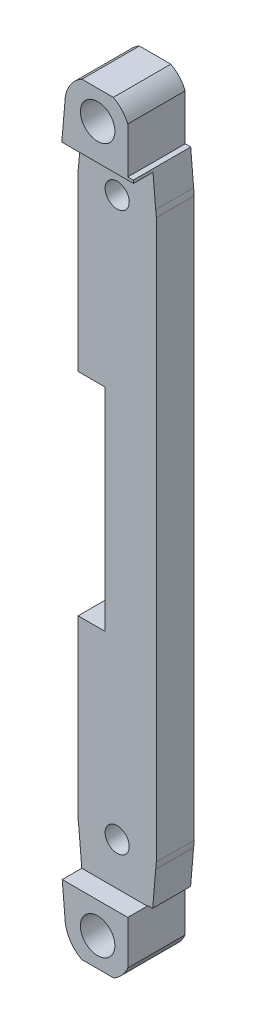
ISO-10303-21;
HEADER;
FILE_DESCRIPTION(('STEP AP214'),'2;1');
FILE_NAME('part.step','',(''),(''),'','','');
FILE_SCHEMA(('AUTOMOTIVE_DESIGN { 1 0 10303 214 1 1 1 1 }'));
ENDSEC;
DATA;
#1=APPLICATION_CONTEXT('core data for automotive mechanical design processes');
#2=APPLICATION_PROTOCOL_DEFINITION('international standard','automotive_design',2000,#1);
#3=PRODUCT_CONTEXT('',#1,'mechanical');
#4=PRODUCT('Part','Part','',(#3));
#5=PRODUCT_RELATED_PRODUCT_CATEGORY('part','',(#4));
#6=PRODUCT_DEFINITION_FORMATION('','',#4);
#7=PRODUCT_DEFINITION_CONTEXT('part definition',#1,'design');
#8=PRODUCT_DEFINITION('design','',#6,#7);
#9=PRODUCT_DEFINITION_SHAPE('','',#8);
#10=(LENGTH_UNIT() NAMED_UNIT(*) SI_UNIT(.MILLI.,.METRE.));
#11=(NAMED_UNIT(*) PLANE_ANGLE_UNIT() SI_UNIT($,.RADIAN.));
#12=(NAMED_UNIT(*) SI_UNIT($,.STERADIAN.) SOLID_ANGLE_UNIT());
#13=UNCERTAINTY_MEASURE_WITH_UNIT(LENGTH_MEASURE(1.E-05),#10,'distance_accuracy_value','');
#14=(GEOMETRIC_REPRESENTATION_CONTEXT(3) GLOBAL_UNCERTAINTY_ASSIGNED_CONTEXT((#13)) GLOBAL_UNIT_ASSIGNED_CONTEXT((#10,
#11,#12)) REPRESENTATION_CONTEXT('',''));
#15=CARTESIAN_POINT('',(0.,0.,0.));
#16=DIRECTION('',(0.,0.,1.));
#17=DIRECTION('',(1.,0.,0.));
#18=AXIS2_PLACEMENT_3D('',#15,#16,#17);
#19=CARTESIAN_POINT('',(-44.1261324023902,30.2904471176475,5.));
#20=DIRECTION('',(0.,0.,-1.));
#21=DIRECTION('',(-1.,0.,0.));
#22=AXIS2_PLACEMENT_3D('',#19,#20,#21);
#23=CYLINDRICAL_SURFACE('',#22,2.85);
#24=CARTESIAN_POINT('',(-44.1261324023902,30.2904471176475,5.));
#25=DIRECTION('',(0.,0.,1.));
#26=DIRECTION('',(1.,0.,0.));
#27=AXIS2_PLACEMENT_3D('',#24,#25,#26);
#28=CIRCLE('',#27,2.85);
#29=CARTESIAN_POINT('',(-45.4931797029006,32.7911833448749,5.));
#30=VERTEX_POINT('',#29);
#31=CARTESIAN_POINT('',(-46.9761324023902,30.2904471176475,5.));
#32=VERTEX_POINT('',#31);
#33=EDGE_CURVE('E391',#30,#32,#28,.T.);
#34=ORIENTED_EDGE('',*,*,#33,.F.);
#35=DIRECTION('',(0.,0.,-1.));
#36=VECTOR('',#35,1.);
#37=CARTESIAN_POINT('',(-45.4931797029006,32.7911833448749,5.));
#38=LINE('',#37,#36);
#39=CARTESIAN_POINT('',(-45.4931797029006,32.7911833448749,0.));
#40=VERTEX_POINT('',#39);
#41=EDGE_CURVE('E259',#30,#40,#38,.T.);
#42=ORIENTED_EDGE('',*,*,#41,.T.);
#43=CARTESIAN_POINT('',(-44.1261324023902,30.2904471176475,0.));
#44=DIRECTION('',(0.,0.,1.));
#45=DIRECTION('',(1.,0.,0.));
#46=AXIS2_PLACEMENT_3D('',#43,#44,#45);
#47=CIRCLE('',#46,2.85);
#48=CARTESIAN_POINT('',(-46.9761324023902,30.2904471176475,0.));
#49=VERTEX_POINT('',#48);
#50=EDGE_CURVE('E410',#40,#49,#47,.T.);
#51=ORIENTED_EDGE('',*,*,#50,.T.);
#52=DIRECTION('',(0.,0.,-1.));
#53=VECTOR('',#52,1.);
#54=CARTESIAN_POINT('',(-46.9761324023902,30.2904471176475,5.));
#55=LINE('',#54,#53);
#56=EDGE_CURVE('E435',#32,#49,#55,.T.);
#57=ORIENTED_EDGE('',*,*,#56,.F.);
#58=EDGE_LOOP('',(#34,#42,#51,#57));
#59=FACE_BOUND('',#58,.T.);
#60=ADVANCED_FACE('F34',(#59),#23,.T.);
#61=CARTESIAN_POINT('',(-44.1261324023902,-31.0495528823525,5.));
#62=DIRECTION('',(0.,0.,-1.));
#63=DIRECTION('',(-1.,0.,0.));
#64=AXIS2_PLACEMENT_3D('',#61,#62,#63);
#65=CYLINDRICAL_SURFACE('',#64,2.85);
#66=CARTESIAN_POINT('',(-44.1261324023902,-31.0495528823525,0.));
#67=DIRECTION('',(0.,0.,1.));
#68=DIRECTION('',(1.,0.,0.));
#69=AXIS2_PLACEMENT_3D('',#66,#67,#68);
#70=CIRCLE('',#69,2.85);
#71=CARTESIAN_POINT('',(-42.7268335781129,-33.532386505529,0.));
#72=VERTEX_POINT('',#71);
#73=CARTESIAN_POINT('',(-41.5056305366104,-32.17003044636,0.));
#74=VERTEX_POINT('',#73);
#75=EDGE_CURVE('E422',#72,#74,#70,.T.);
#76=ORIENTED_EDGE('',*,*,#75,.T.);
#77=DIRECTION('',(0.,0.,-1.));
#78=VECTOR('',#77,1.);
#79=CARTESIAN_POINT('',(-41.5056305366104,-32.17003044636,5.));
#80=LINE('',#79,#78);
#81=CARTESIAN_POINT('',(-41.5056305366104,-32.17003044636,5.));
#82=VERTEX_POINT('',#81);
#83=EDGE_CURVE('E249',#74,#82,#80,.F.);
#84=ORIENTED_EDGE('',*,*,#83,.T.);
#85=CARTESIAN_POINT('',(-44.1261324023902,-31.0495528823525,5.));
#86=DIRECTION('',(0.,0.,1.));
#87=DIRECTION('',(1.,0.,0.));
#88=AXIS2_PLACEMENT_3D('',#85,#86,#87);
#89=CIRCLE('',#88,2.85);
#90=CARTESIAN_POINT('',(-42.7268335781129,-33.532386505529,5.));
#91=VERTEX_POINT('',#90);
#92=EDGE_CURVE('E401',#91,#82,#89,.T.);
#93=ORIENTED_EDGE('',*,*,#92,.F.);
#94=DIRECTION('',(0.,0.,-1.));
#95=VECTOR('',#94,1.);
#96=CARTESIAN_POINT('',(-42.7268335781129,-33.532386505529,5.));
#97=LINE('',#96,#95);
#98=EDGE_CURVE('E265',#91,#72,#97,.T.);
#99=ORIENTED_EDGE('',*,*,#98,.T.);
#100=EDGE_LOOP('',(#76,#84,#93,#99));
#101=FACE_BOUND('',#100,.T.);
#102=ADVANCED_FACE('F563',(#101),#65,.T.);
#103=CARTESIAN_POINT('',(-47.5261324023902,0.,5.));
#104=DIRECTION('',(-1.,0.,0.));
#105=DIRECTION('',(0.,0.,1.));
#106=AXIS2_PLACEMENT_3D('',#103,#104,#105);
#107=PLANE('',#106);
#108=DIRECTION('',(0.,0.,-1.));
#109=VECTOR('',#108,1.);
#110=CARTESIAN_POINT('',(-47.5261324023902,-9.49691108424844,11.7));
#111=LINE('',#110,#109);
#112=CARTESIAN_POINT('',(-47.5261324023902,-9.49691108424844,3.3));
#113=VERTEX_POINT('',#112);
#114=CARTESIAN_POINT('',(-47.5261324023902,-9.49691108424844,0.));
#115=VERTEX_POINT('',#114);
#116=EDGE_CURVE('E283',#113,#115,#111,.T.);
#117=ORIENTED_EDGE('',*,*,#116,.T.);
#118=DIRECTION('',(0.,1.,0.));
#119=VECTOR('',#118,1.);
#120=CARTESIAN_POINT('',(-47.5261324023902,0.,0.));
#121=LINE('',#120,#119);
#122=CARTESIAN_POINT('',(-47.5261324023902,-24.6495528823525,0.));
#123=VERTEX_POINT('',#122);
#124=EDGE_CURVE('E416',#123,#115,#121,.T.);
#125=ORIENTED_EDGE('',*,*,#124,.F.);
#126=DIRECTION('',(0.,0.,-1.));
#127=VECTOR('',#126,1.);
#128=CARTESIAN_POINT('',(-47.5261324023902,-24.6495528823525,5.));
#129=LINE('',#128,#127);
#130=CARTESIAN_POINT('',(-47.5261324023902,-24.6495528823525,3.3));
#131=VERTEX_POINT('',#130);
#132=EDGE_CURVE('E430',#131,#123,#129,.T.);
#133=ORIENTED_EDGE('',*,*,#132,.F.);
#134=DIRECTION('',(0.,1.,0.));
#135=VECTOR('',#134,1.);
#136=CARTESIAN_POINT('',(-47.5261324023902,0.,3.3));
#137=LINE('',#136,#135);
#138=EDGE_CURVE('E313',#131,#113,#137,.T.);
#139=ORIENTED_EDGE('',*,*,#138,.T.);
#140=EDGE_LOOP('',(#117,#125,#133,#139));
#141=FACE_BOUND('',#140,.T.);
#142=ADVANCED_FACE('F477',(#141),#107,.T.);
#143=CARTESIAN_POINT('',(-40.7261324023902,0.,5.));
#144=DIRECTION('',(1.,0.,0.));
#145=DIRECTION('',(0.,0.,-1.));
#146=AXIS2_PLACEMENT_3D('',#143,#144,#145);
#147=PLANE('',#146);
#148=DIRECTION('',(0.,0.,-1.));
#149=VECTOR('',#148,1.);
#150=CARTESIAN_POINT('',(-40.7261324023902,23.8904471176475,5.));
#151=LINE('',#150,#149);
#152=CARTESIAN_POINT('',(-40.7261324023902,23.8904471176475,3.3));
#153=VERTEX_POINT('',#152);
#154=CARTESIAN_POINT('',(-40.7261324023902,23.8904471176475,0.));
#155=VERTEX_POINT('',#154);
#156=EDGE_CURVE('E438',#153,#155,#151,.T.);
#157=ORIENTED_EDGE('',*,*,#156,.F.);
#158=DIRECTION('',(0.,-1.,0.));
#159=VECTOR('',#158,1.);
#160=CARTESIAN_POINT('',(-40.7261324023902,0.,3.3));
#161=LINE('',#160,#159);
#162=CARTESIAN_POINT('',(-40.7261324023902,-24.6495528823525,3.3));
#163=VERTEX_POINT('',#162);
#164=EDGE_CURVE('E328',#153,#163,#161,.T.);
#165=ORIENTED_EDGE('',*,*,#164,.T.);
#166=DIRECTION('',(0.,0.,-1.));
#167=VECTOR('',#166,1.);
#168=CARTESIAN_POINT('',(-40.7261324023902,-24.6495528823525,5.));
#169=LINE('',#168,#167);
#170=CARTESIAN_POINT('',(-40.7261324023902,-24.6495528823525,0.));
#171=VERTEX_POINT('',#170);
#172=EDGE_CURVE('E405',#163,#171,#169,.T.);
#173=ORIENTED_EDGE('',*,*,#172,.T.);
#174=DIRECTION('',(0.,-1.,0.));
#175=VECTOR('',#174,1.);
#176=CARTESIAN_POINT('',(-40.7261324023902,0.,0.));
#177=LINE('',#176,#175);
#178=EDGE_CURVE('E388',#155,#171,#177,.T.);
#179=ORIENTED_EDGE('',*,*,#178,.F.);
#180=EDGE_LOOP('',(#157,#165,#173,#179));
#181=FACE_BOUND('',#180,.T.);
#182=ADVANCED_FACE('F36',(#181),#147,.T.);
#183=DIRECTION('',(0.,0.,-1.));
#184=VECTOR('',#183,1.);
#185=CARTESIAN_POINT('',(-47.5261324023902,8.90561472574801,11.7));
#186=LINE('',#185,#184);
#187=CARTESIAN_POINT('',(-47.5261324023902,8.90561472574801,3.3));
#188=VERTEX_POINT('',#187);
#189=CARTESIAN_POINT('',(-47.5261324023902,8.90561472574801,0.));
#190=VERTEX_POINT('',#189);
#191=EDGE_CURVE('E282',#188,#190,#186,.T.);
#192=ORIENTED_EDGE('',*,*,#191,.F.);
#193=CARTESIAN_POINT('',(-47.5261324023902,23.8904471176475,3.3));
#194=VERTEX_POINT('',#193);
#195=EDGE_CURVE('E312',#188,#194,#137,.T.);
#196=ORIENTED_EDGE('',*,*,#195,.T.);
#197=DIRECTION('',(0.,0.,-1.));
#198=VECTOR('',#197,1.);
#199=CARTESIAN_POINT('',(-47.5261324023902,23.8904471176475,5.));
#200=LINE('',#199,#198);
#201=CARTESIAN_POINT('',(-47.5261324023902,23.8904471176475,0.));
#202=VERTEX_POINT('',#201);
#203=EDGE_CURVE('E432',#194,#202,#200,.T.);
#204=ORIENTED_EDGE('',*,*,#203,.T.);
#205=EDGE_CURVE('E415',#190,#202,#121,.T.);
#206=ORIENTED_EDGE('',*,*,#205,.F.);
#207=EDGE_LOOP('',(#192,#196,#204,#206));
#208=FACE_BOUND('',#207,.T.);
#209=ADVANCED_FACE('F497',(#208),#107,.T.);
#210=CARTESIAN_POINT('',(0.,0.,5.));
#211=DIRECTION('',(0.,0.,1.));
#212=DIRECTION('',(1.,0.,0.));
#213=AXIS2_PLACEMENT_3D('',#210,#211,#212);
#214=PLANE('',#213);
#215=DIRECTION('',(0.,-1.,0.));
#216=VECTOR('',#215,1.);
#217=CARTESIAN_POINT('',(-41.5056305366104,0.,5.));
#218=LINE('',#217,#216);
#219=CARTESIAN_POINT('',(-41.5056305366104,31.4109246816551,5.));
#220=VERTEX_POINT('',#219);
#221=CARTESIAN_POINT('',(-41.5056305366104,27.4189181705271,5.));
#222=VERTEX_POINT('',#221);
#223=EDGE_CURVE('E224',#220,#222,#218,.T.);
#224=ORIENTED_EDGE('',*,*,#223,.F.);
#225=CARTESIAN_POINT('',(-42.7590851018798,32.7911833448749,5.));
#226=VERTEX_POINT('',#225);
#227=EDGE_CURVE('E394',#220,#226,#28,.T.);
#228=ORIENTED_EDGE('',*,*,#227,.T.);
#229=DIRECTION('',(1.,0.,0.));
#230=VECTOR('',#229,1.);
#231=CARTESIAN_POINT('',(0.,32.7911833448749,5.));
#232=LINE('',#231,#230);
#233=EDGE_CURVE('E257',#30,#226,#232,.T.);
#234=ORIENTED_EDGE('',*,*,#233,.F.);
#235=ORIENTED_EDGE('',*,*,#33,.T.);
#236=DIRECTION('',(0.0856219118234825,0.996327701218676,0.));
#237=VECTOR('',#236,1.);
#238=CARTESIAN_POINT('',(-49.2157469144144,4.22947825045761,5.));
#239=LINE('',#238,#237);
#240=CARTESIAN_POINT('',(-47.243450602524,27.1798353342732,5.));
#241=VERTEX_POINT('',#240);
#242=EDGE_CURVE('E395',#241,#32,#239,.T.);
#243=ORIENTED_EDGE('',*,*,#242,.F.);
#244=DIRECTION('',(-1.,0.,0.));
#245=VECTOR('',#244,1.);
#246=CARTESIAN_POINT('',(-48.434796852721,27.1798353342732,5.));
#247=LINE('',#246,#245);
#248=CARTESIAN_POINT('',(-41.0088142022565,27.1798353342732,5.));
#249=VERTEX_POINT('',#248);
#250=EDGE_CURVE('E296',#249,#241,#247,.T.);
#251=ORIENTED_EDGE('',*,*,#250,.F.);
#252=DIRECTION('',(0.0856219118234803,-0.996327701218677,0.));
#253=VECTOR('',#252,1.);
#254=CARTESIAN_POINT('',(-38.3895306718639,-3.29910029211332,5.));
#255=LINE('',#254,#253);
#256=CARTESIAN_POINT('',(-41.0293603834971,27.4189181705271,5.));
#257=VERTEX_POINT('',#256);
#258=EDGE_CURVE('E389',#257,#249,#255,.T.);
#259=ORIENTED_EDGE('',*,*,#258,.F.);
#260=DIRECTION('',(1.,0.,0.));
#261=VECTOR('',#260,1.);
#262=CARTESIAN_POINT('',(0.,27.4189181705271,5.));
#263=LINE('',#262,#261);
#264=EDGE_CURVE('E269',#222,#257,#263,.T.);
#265=ORIENTED_EDGE('',*,*,#264,.F.);
#266=EDGE_LOOP('',(#224,#228,#234,#235,#243,#251,#259,#265));
#267=FACE_BOUND('',#266,.T.);
#268=CARTESIAN_POINT('',(-44.1261324023902,30.2904471176475,5.));
#269=DIRECTION('',(0.,0.,-1.));
#270=DIRECTION('',(-1.,0.,0.));
#271=AXIS2_PLACEMENT_3D('',#268,#269,#270);
#272=CIRCLE('',#271,1.5);
#273=CARTESIAN_POINT('',(-45.6261324023902,30.2904471176475,5.));
#274=VERTEX_POINT('',#273);
#275=EDGE_CURVE('E385',#274,#274,#272,.T.);
#276=ORIENTED_EDGE('',*,*,#275,.T.);
#277=EDGE_LOOP('',(#276));
#278=FACE_BOUND('',#277,.T.);
#279=ADVANCED_FACE('F519',(#267,#278),#214,.T.);
#280=CARTESIAN_POINT('',(-44.1261324023902,23.8904471176475,5.));
#281=DIRECTION('',(0.,0.,-1.));
#282=DIRECTION('',(-1.,0.,0.));
#283=AXIS2_PLACEMENT_3D('',#280,#281,#282);
#284=CYLINDRICAL_SURFACE('',#283,3.40000000000001);
#285=ORIENTED_EDGE('',*,*,#203,.F.);
#286=CARTESIAN_POINT('',(-44.1261324023902,23.8904471176475,3.3));
#287=DIRECTION('',(0.,0.,1.));
#288=DIRECTION('',(1.,0.,0.));
#289=AXIS2_PLACEMENT_3D('',#286,#287,#288);
#290=CIRCLE('',#289,3.40000000000001);
#291=CARTESIAN_POINT('',(-47.4762808422569,24.4705379991986,3.3));
#292=VERTEX_POINT('',#291);
#293=EDGE_CURVE('E316',#194,#292,#290,.F.);
#294=ORIENTED_EDGE('',*,*,#293,.T.);
#295=DIRECTION('',(0.,0.,-1.));
#296=VECTOR('',#295,1.);
#297=CARTESIAN_POINT('',(-47.4762808422569,24.4705379991986,5.));
#298=LINE('',#297,#296);
#299=CARTESIAN_POINT('',(-47.4762808422569,24.4705379991986,0.));
#300=VERTEX_POINT('',#299);
#301=EDGE_CURVE('E377',#292,#300,#298,.T.);
#302=ORIENTED_EDGE('',*,*,#301,.T.);
#303=CARTESIAN_POINT('',(-44.1261324023902,23.8904471176475,0.));
#304=DIRECTION('',(0.,0.,-1.));
#305=DIRECTION('',(-1.,0.,0.));
#306=AXIS2_PLACEMENT_3D('',#303,#304,#305);
#307=CIRCLE('',#306,3.40000000000001);
#308=EDGE_CURVE('E374',#202,#300,#307,.T.);
#309=ORIENTED_EDGE('',*,*,#308,.F.);
#310=EDGE_LOOP('',(#285,#294,#302,#309));
#311=FACE_BOUND('',#310,.T.);
#312=ADVANCED_FACE('F502',(#311),#284,.T.);
#313=DIRECTION('',(0.,0.,-1.));
#314=VECTOR('',#313,1.);
#315=CARTESIAN_POINT('',(-40.7759839625235,24.4705379991986,5.));
#316=LINE('',#315,#314);
#317=CARTESIAN_POINT('',(-40.7759839625235,24.4705379991986,0.));
#318=VERTEX_POINT('',#317);
#319=CARTESIAN_POINT('',(-40.7759839625235,24.4705379991986,3.3));
#320=VERTEX_POINT('',#319);
#321=EDGE_CURVE('E379',#318,#320,#316,.F.);
#322=ORIENTED_EDGE('',*,*,#321,.T.);
#323=CARTESIAN_POINT('',(-44.1261324023902,23.8904471176475,3.3));
#324=DIRECTION('',(0.,0.,1.));
#325=DIRECTION('',(1.,0.,0.));
#326=AXIS2_PLACEMENT_3D('',#323,#324,#325);
#327=CIRCLE('',#326,3.40000000000001);
#328=EDGE_CURVE('E331',#320,#153,#327,.F.);
#329=ORIENTED_EDGE('',*,*,#328,.T.);
#330=ORIENTED_EDGE('',*,*,#156,.T.);
#331=EDGE_CURVE('E373',#318,#155,#307,.T.);
#332=ORIENTED_EDGE('',*,*,#331,.F.);
#333=EDGE_LOOP('',(#322,#329,#330,#332));
#334=FACE_BOUND('',#333,.T.);
#335=ADVANCED_FACE('F532',(#334),#284,.T.);
#336=CARTESIAN_POINT('',(-44.1261324023902,-24.6495528823525,5.));
#337=DIRECTION('',(0.,0.,-1.));
#338=DIRECTION('',(-1.,0.,0.));
#339=AXIS2_PLACEMENT_3D('',#336,#337,#338);
#340=CYLINDRICAL_SURFACE('',#339,3.40000000000001);
#341=ORIENTED_EDGE('',*,*,#172,.F.);
#342=CARTESIAN_POINT('',(-44.1261324023902,-24.6495528823525,3.3));
#343=DIRECTION('',(0.,0.,1.));
#344=DIRECTION('',(1.,0.,0.));
#345=AXIS2_PLACEMENT_3D('',#342,#343,#344);
#346=CIRCLE('',#345,3.40000000000001);
#347=CARTESIAN_POINT('',(-40.7759839625235,-25.2296437639036,3.3));
#348=VERTEX_POINT('',#347);
#349=EDGE_CURVE('E322',#163,#348,#346,.F.);
#350=ORIENTED_EDGE('',*,*,#349,.T.);
#351=DIRECTION('',(0.,0.,-1.));
#352=VECTOR('',#351,1.);
#353=CARTESIAN_POINT('',(-40.7759839625235,-25.2296437639036,5.));
#354=LINE('',#353,#352);
#355=CARTESIAN_POINT('',(-40.7759839625235,-25.2296437639036,0.));
#356=VERTEX_POINT('',#355);
#357=EDGE_CURVE('E368',#348,#356,#354,.T.);
#358=ORIENTED_EDGE('',*,*,#357,.T.);
#359=CARTESIAN_POINT('',(-44.1261324023902,-24.6495528823525,0.));
#360=DIRECTION('',(0.,0.,-1.));
#361=DIRECTION('',(-1.,0.,0.));
#362=AXIS2_PLACEMENT_3D('',#359,#360,#361);
#363=CIRCLE('',#362,3.40000000000001);
#364=EDGE_CURVE('E367',#171,#356,#363,.T.);
#365=ORIENTED_EDGE('',*,*,#364,.F.);
#366=EDGE_LOOP('',(#341,#350,#358,#365));
#367=FACE_BOUND('',#366,.T.);
#368=ADVANCED_FACE('F654',(#367),#340,.T.);
#369=DIRECTION('',(0.,0.,-1.));
#370=VECTOR('',#369,1.);
#371=CARTESIAN_POINT('',(-47.4762808422569,-25.2296437639036,5.));
#372=LINE('',#371,#370);
#373=CARTESIAN_POINT('',(-47.4762808422569,-25.2296437639036,0.));
#374=VERTEX_POINT('',#373);
#375=CARTESIAN_POINT('',(-47.4762808422569,-25.2296437639036,3.3));
#376=VERTEX_POINT('',#375);
#377=EDGE_CURVE('E370',#374,#376,#372,.F.);
#378=ORIENTED_EDGE('',*,*,#377,.T.);
#379=CARTESIAN_POINT('',(-44.1261324023902,-24.6495528823525,3.3));
#380=DIRECTION('',(0.,0.,1.));
#381=DIRECTION('',(1.,0.,0.));
#382=AXIS2_PLACEMENT_3D('',#379,#380,#381);
#383=CIRCLE('',#382,3.40000000000001);
#384=EDGE_CURVE('E306',#376,#131,#383,.F.);
#385=ORIENTED_EDGE('',*,*,#384,.T.);
#386=ORIENTED_EDGE('',*,*,#132,.T.);
#387=EDGE_CURVE('E364',#374,#123,#363,.T.);
#388=ORIENTED_EDGE('',*,*,#387,.F.);
#389=EDGE_LOOP('',(#378,#385,#386,#388));
#390=FACE_BOUND('',#389,.T.);
#391=ADVANCED_FACE('F662',(#390),#340,.T.);
#392=CARTESIAN_POINT('',(-44.1261324023902,-24.6495528823525,5.));
#393=DIRECTION('',(0.,0.,-1.));
#394=DIRECTION('',(-1.,0.,0.));
#395=AXIS2_PLACEMENT_3D('',#392,#393,#394);
#396=CYLINDRICAL_SURFACE('',#395,1.05);
#397=CARTESIAN_POINT('',(-44.1261324023902,-24.6495528823525,0.));
#398=DIRECTION('',(0.,0.,-1.));
#399=DIRECTION('',(-1.,0.,0.));
#400=AXIS2_PLACEMENT_3D('',#397,#398,#399);
#401=CIRCLE('',#400,1.05);
#402=CARTESIAN_POINT('',(-45.1761324023902,-24.6495528823525,0.));
#403=VERTEX_POINT('',#402);
#404=EDGE_CURVE('E361',#403,#403,#401,.T.);
#405=ORIENTED_EDGE('',*,*,#404,.T.);
#406=EDGE_LOOP('',(#405));
#407=FACE_BOUND('',#406,.T.);
#408=CARTESIAN_POINT('',(-44.1261324023902,-24.6495528823525,3.3));
#409=DIRECTION('',(0.,0.,1.));
#410=DIRECTION('',(1.,0.,0.));
#411=AXIS2_PLACEMENT_3D('',#408,#409,#410);
#412=CIRCLE('',#411,1.05);
#413=CARTESIAN_POINT('',(-43.0761324023902,-24.6495528823525,3.3));
#414=VERTEX_POINT('',#413);
#415=EDGE_CURVE('E303',#414,#414,#412,.F.);
#416=ORIENTED_EDGE('',*,*,#415,.F.);
#417=EDGE_LOOP('',(#416));
#418=FACE_BOUND('',#417,.T.);
#419=ADVANCED_FACE('F671',(#407,#418),#396,.F.);
#420=CARTESIAN_POINT('',(-44.1261324023902,23.8904471176475,5.));
#421=DIRECTION('',(0.,0.,-1.));
#422=DIRECTION('',(-1.,0.,0.));
#423=AXIS2_PLACEMENT_3D('',#420,#421,#422);
#424=CYLINDRICAL_SURFACE('',#423,1.05);
#425=CARTESIAN_POINT('',(-44.1261324023902,23.8904471176475,0.));
#426=DIRECTION('',(0.,0.,-1.));
#427=DIRECTION('',(-1.,0.,0.));
#428=AXIS2_PLACEMENT_3D('',#425,#426,#427);
#429=CIRCLE('',#428,1.05);
#430=CARTESIAN_POINT('',(-45.1761324023902,23.8904471176475,0.));
#431=VERTEX_POINT('',#430);
#432=EDGE_CURVE('E358',#431,#431,#429,.T.);
#433=ORIENTED_EDGE('',*,*,#432,.T.);
#434=EDGE_LOOP('',(#433));
#435=FACE_BOUND('',#434,.T.);
#436=CARTESIAN_POINT('',(-44.1261324023902,23.8904471176475,3.3));
#437=DIRECTION('',(0.,0.,1.));
#438=DIRECTION('',(1.,0.,0.));
#439=AXIS2_PLACEMENT_3D('',#436,#437,#438);
#440=CIRCLE('',#439,1.05);
#441=CARTESIAN_POINT('',(-43.0761324023902,23.8904471176475,3.3));
#442=VERTEX_POINT('',#441);
#443=EDGE_CURVE('E299',#442,#442,#440,.F.);
#444=ORIENTED_EDGE('',*,*,#443,.F.);
#445=EDGE_LOOP('',(#444));
#446=FACE_BOUND('',#445,.T.);
#447=ADVANCED_FACE('F597',(#435,#446),#424,.F.);
#448=CARTESIAN_POINT('',(-44.1261324023902,-31.0495528823525,5.));
#449=DIRECTION('',(0.,0.,-1.));
#450=DIRECTION('',(-1.,0.,0.));
#451=AXIS2_PLACEMENT_3D('',#448,#449,#450);
#452=CYLINDRICAL_SURFACE('',#451,1.5);
#453=CARTESIAN_POINT('',(-44.1261324023902,-31.0495528823525,5.));
#454=DIRECTION('',(0.,0.,-1.));
#455=DIRECTION('',(-1.,0.,0.));
#456=AXIS2_PLACEMENT_3D('',#453,#454,#455);
#457=CIRCLE('',#456,1.5);
#458=CARTESIAN_POINT('',(-45.6261324023902,-31.0495528823525,5.));
#459=VERTEX_POINT('',#458);
#460=EDGE_CURVE('E382',#459,#459,#457,.T.);
#461=ORIENTED_EDGE('',*,*,#460,.F.);
#462=EDGE_LOOP('',(#461));
#463=FACE_BOUND('',#462,.T.);
#464=CARTESIAN_POINT('',(-44.1261324023902,-31.0495528823525,2.));
#465=DIRECTION('',(0.,0.,-1.));
#466=DIRECTION('',(-1.,0.,0.));
#467=AXIS2_PLACEMENT_3D('',#464,#465,#466);
#468=CIRCLE('',#467,1.5);
#469=CARTESIAN_POINT('',(-45.6261324023902,-31.0495528823525,2.));
#470=VERTEX_POINT('',#469);
#471=EDGE_CURVE('E348',#470,#470,#468,.F.);
#472=ORIENTED_EDGE('',*,*,#471,.F.);
#473=EDGE_LOOP('',(#472));
#474=FACE_BOUND('',#473,.T.);
#475=ADVANCED_FACE('F591',(#463,#474),#452,.F.);
#476=CARTESIAN_POINT('',(-44.1261324023902,30.2904471176475,5.));
#477=DIRECTION('',(0.,0.,-1.));
#478=DIRECTION('',(-1.,0.,0.));
#479=AXIS2_PLACEMENT_3D('',#476,#477,#478);
#480=CYLINDRICAL_SURFACE('',#479,1.5);
#481=ORIENTED_EDGE('',*,*,#275,.F.);
#482=EDGE_LOOP('',(#481));
#483=FACE_BOUND('',#482,.T.);
#484=CARTESIAN_POINT('',(-44.1261324023902,30.2904471176475,2.));
#485=DIRECTION('',(0.,0.,-1.));
#486=DIRECTION('',(-1.,0.,0.));
#487=AXIS2_PLACEMENT_3D('',#484,#485,#486);
#488=CIRCLE('',#487,1.5);
#489=CARTESIAN_POINT('',(-45.6261324023902,30.2904471176475,2.));
#490=VERTEX_POINT('',#489);
#491=EDGE_CURVE('E354',#490,#490,#488,.F.);
#492=ORIENTED_EDGE('',*,*,#491,.F.);
#493=EDGE_LOOP('',(#492));
#494=FACE_BOUND('',#493,.T.);
#495=ADVANCED_FACE('F587',(#483,#494),#480,.F.);
#496=CARTESIAN_POINT('',(-38.3895306718639,-3.29910029211332,5.));
#497=DIRECTION('',(0.996327701218677,0.0856219118234803,0.));
#498=DIRECTION('',(-0.0856219118234803,0.996327701218677,0.));
#499=AXIS2_PLACEMENT_3D('',#496,#497,#498);
#500=PLANE('',#499);
#501=DIRECTION('',(0.,0.,-1.));
#502=VECTOR('',#501,1.);
#503=CARTESIAN_POINT('',(-41.0293603834971,27.4189181705271,5.));
#504=LINE('',#503,#502);
#505=CARTESIAN_POINT('',(-41.0293603834971,27.4189181705271,0.));
#506=VERTEX_POINT('',#505);
#507=EDGE_CURVE('E57',#257,#506,#504,.T.);
#508=ORIENTED_EDGE('',*,*,#507,.F.);
#509=ORIENTED_EDGE('',*,*,#258,.T.);
#510=DIRECTION('',(0.,0.,1.));
#511=VECTOR('',#510,1.);
#512=CARTESIAN_POINT('',(-41.0088142022565,27.1798353342732,5.));
#513=LINE('',#512,#511);
#514=CARTESIAN_POINT('',(-41.0088142022565,27.1798353342732,3.3));
#515=VERTEX_POINT('',#514);
#516=EDGE_CURVE('E341',#515,#249,#513,.T.);
#517=ORIENTED_EDGE('',*,*,#516,.F.);
#518=DIRECTION('',(0.0856219118234803,-0.996327701218677,0.));
#519=VECTOR('',#518,1.);
#520=CARTESIAN_POINT('',(-38.3895306718639,-3.29910029211332,3.3));
#521=LINE('',#520,#519);
#522=EDGE_CURVE('E334',#515,#320,#521,.T.);
#523=ORIENTED_EDGE('',*,*,#522,.T.);
#524=ORIENTED_EDGE('',*,*,#321,.F.);
#525=DIRECTION('',(0.0856219118234803,-0.996327701218677,0.));
#526=VECTOR('',#525,1.);
#527=CARTESIAN_POINT('',(-38.3895306718639,-3.29910029211332,0.));
#528=LINE('',#527,#526);
#529=EDGE_CURVE('E408',#506,#318,#528,.T.);
#530=ORIENTED_EDGE('',*,*,#529,.F.);
#531=EDGE_LOOP('',(#508,#509,#517,#523,#524,#530));
#532=FACE_BOUND('',#531,.T.);
#533=ADVANCED_FACE('F525',(#532),#500,.T.);
#534=ORIENTED_EDGE('',*,*,#227,.F.);
#535=DIRECTION('',(0.,0.,-1.));
#536=VECTOR('',#535,1.);
#537=CARTESIAN_POINT('',(-41.5056305366104,31.4109246816551,5.));
#538=LINE('',#537,#536);
#539=CARTESIAN_POINT('',(-41.5056305366104,31.4109246816551,0.));
#540=VERTEX_POINT('',#539);
#541=EDGE_CURVE('E271',#220,#540,#538,.T.);
#542=ORIENTED_EDGE('',*,*,#541,.T.);
#543=CARTESIAN_POINT('',(-42.7590851018798,32.7911833448749,0.));
#544=VERTEX_POINT('',#543);
#545=EDGE_CURVE('E236',#540,#544,#47,.T.);
#546=ORIENTED_EDGE('',*,*,#545,.T.);
#547=DIRECTION('',(0.,0.,-1.));
#548=VECTOR('',#547,1.);
#549=CARTESIAN_POINT('',(-42.7590851018798,32.7911833448749,5.));
#550=LINE('',#549,#548);
#551=EDGE_CURVE('E254',#544,#226,#550,.F.);
#552=ORIENTED_EDGE('',*,*,#551,.T.);
#553=EDGE_LOOP('',(#534,#542,#546,#552));
#554=FACE_BOUND('',#553,.T.);
#555=ADVANCED_FACE('F516',(#554),#23,.T.);
#556=CARTESIAN_POINT('',(-49.2157469144144,4.22947825045761,5.));
#557=DIRECTION('',(-0.996327701218676,0.0856219118234824,0.));
#558=DIRECTION('',(-0.0856219118234824,-0.996327701218676,0.));
#559=AXIS2_PLACEMENT_3D('',#556,#557,#558);
#560=PLANE('',#559);
#561=DIRECTION('',(0.,0.,-1.));
#562=VECTOR('',#561,1.);
#563=CARTESIAN_POINT('',(-47.243450602524,27.1798353342732,5.));
#564=LINE('',#563,#562);
#565=CARTESIAN_POINT('',(-47.243450602524,27.1798353342732,3.3));
#566=VERTEX_POINT('',#565);
#567=EDGE_CURVE('E339',#241,#566,#564,.T.);
#568=ORIENTED_EDGE('',*,*,#567,.F.);
#569=ORIENTED_EDGE('',*,*,#242,.T.);
#570=ORIENTED_EDGE('',*,*,#56,.T.);
#571=DIRECTION('',(0.0856219118234825,0.996327701218676,0.));
#572=VECTOR('',#571,1.);
#573=CARTESIAN_POINT('',(-49.2157469144144,4.22947825045761,0.));
#574=LINE('',#573,#572);
#575=EDGE_CURVE('E412',#300,#49,#574,.T.);
#576=ORIENTED_EDGE('',*,*,#575,.F.);
#577=ORIENTED_EDGE('',*,*,#301,.F.);
#578=DIRECTION('',(0.0856219118234824,0.996327701218676,0.));
#579=VECTOR('',#578,1.);
#580=CARTESIAN_POINT('',(-49.2157469144144,4.22947825045761,3.3));
#581=LINE('',#580,#579);
#582=EDGE_CURVE('E319',#292,#566,#581,.T.);
#583=ORIENTED_EDGE('',*,*,#582,.T.);
#584=EDGE_LOOP('',(#568,#569,#570,#576,#577,#583));
#585=FACE_BOUND('',#584,.T.);
#586=ADVANCED_FACE('F508',(#585),#560,.T.);
#587=CARTESIAN_POINT('',(-49.2805043162141,-4.23504333967472,5.));
#588=DIRECTION('',(-0.996327701218676,-0.0856219118234814,0.));
#589=DIRECTION('',(0.0856219118234814,-0.996327701218677,0.));
#590=AXIS2_PLACEMENT_3D('',#587,#588,#589);
#591=PLANE('',#590);
#592=DIRECTION('',(0.,0.,1.));
#593=VECTOR('',#592,1.);
#594=CARTESIAN_POINT('',(-47.2075680043156,-28.3564840599482,5.));
#595=LINE('',#594,#593);
#596=CARTESIAN_POINT('',(-47.2075680043156,-28.3564840599482,3.3));
#597=VERTEX_POINT('',#596);
#598=CARTESIAN_POINT('',(-47.2075680043156,-28.3564840599482,5.));
#599=VERTEX_POINT('',#598);
#600=EDGE_CURVE('E337',#597,#599,#595,.T.);
#601=ORIENTED_EDGE('',*,*,#600,.F.);
#602=DIRECTION('',(-0.0856219118234814,0.996327701218677,0.));
#603=VECTOR('',#602,1.);
#604=CARTESIAN_POINT('',(-49.2805043162141,-4.23504333967472,3.3));
#605=LINE('',#604,#603);
#606=EDGE_CURVE('E309',#597,#376,#605,.T.);
#607=ORIENTED_EDGE('',*,*,#606,.T.);
#608=ORIENTED_EDGE('',*,*,#377,.F.);
#609=DIRECTION('',(-0.0856219118234814,0.996327701218677,0.));
#610=VECTOR('',#609,1.);
#611=CARTESIAN_POINT('',(-49.2805043162141,-4.23504333967472,0.));
#612=LINE('',#611,#610);
#613=CARTESIAN_POINT('',(-46.9761324023902,-31.0495528823525,0.));
#614=VERTEX_POINT('',#613);
#615=EDGE_CURVE('E419',#614,#374,#612,.T.);
#616=ORIENTED_EDGE('',*,*,#615,.F.);
#617=DIRECTION('',(0.,0.,-1.));
#618=VECTOR('',#617,1.);
#619=CARTESIAN_POINT('',(-46.9761324023902,-31.0495528823525,5.));
#620=LINE('',#619,#618);
#621=CARTESIAN_POINT('',(-46.9761324023902,-31.0495528823525,5.));
#622=VERTEX_POINT('',#621);
#623=EDGE_CURVE('E428',#622,#614,#620,.T.);
#624=ORIENTED_EDGE('',*,*,#623,.F.);
#625=DIRECTION('',(-0.0856219118234814,0.996327701218677,0.));
#626=VECTOR('',#625,1.);
#627=CARTESIAN_POINT('',(-49.2805043162141,-4.23504333967472,5.));
#628=LINE('',#627,#626);
#629=EDGE_CURVE('E398',#622,#599,#628,.T.);
#630=ORIENTED_EDGE('',*,*,#629,.T.);
#631=EDGE_LOOP('',(#601,#607,#608,#616,#624,#630));
#632=FACE_BOUND('',#631,.T.);
#633=ADVANCED_FACE('F470',(#632),#591,.T.);
#634=CARTESIAN_POINT('',(-45.5254312266676,-33.532386505529,0.));
#635=VERTEX_POINT('',#634);
#636=EDGE_CURVE('E423',#614,#635,#70,.T.);
#637=ORIENTED_EDGE('',*,*,#636,.T.);
#638=DIRECTION('',(0.,0.,-1.));
#639=VECTOR('',#638,1.);
#640=CARTESIAN_POINT('',(-45.5254312266676,-33.532386505529,5.));
#641=LINE('',#640,#639);
#642=CARTESIAN_POINT('',(-45.5254312266676,-33.532386505529,5.));
#643=VERTEX_POINT('',#642);
#644=EDGE_CURVE('E49',#635,#643,#641,.F.);
#645=ORIENTED_EDGE('',*,*,#644,.T.);
#646=EDGE_CURVE('E402',#622,#643,#89,.T.);
#647=ORIENTED_EDGE('',*,*,#646,.F.);
#648=ORIENTED_EDGE('',*,*,#623,.T.);
#649=EDGE_LOOP('',(#637,#645,#647,#648));
#650=FACE_BOUND('',#649,.T.);
#651=ADVANCED_FACE('F465',(#650),#65,.T.);
#652=CARTESIAN_POINT('',(-38.3247732700641,3.29353520289619,5.));
#653=DIRECTION('',(0.996327701218676,-0.0856219118234814,0.));
#654=DIRECTION('',(0.0856219118234814,0.996327701218677,0.));
#655=AXIS2_PLACEMENT_3D('',#652,#653,#654);
#656=PLANE('',#655);
#657=DIRECTION('',(0.,0.,1.));
#658=VECTOR('',#657,1.);
#659=CARTESIAN_POINT('',(-41.0389948824323,-28.2901344682962,5.));
#660=LINE('',#659,#658);
#661=CARTESIAN_POINT('',(-41.0389948824323,-28.2901344682962,0.));
#662=VERTEX_POINT('',#661);
#663=CARTESIAN_POINT('',(-41.0389948824323,-28.2901344682962,3.3));
#664=VERTEX_POINT('',#663);
#665=EDGE_CURVE('E252',#662,#664,#660,.T.);
#666=ORIENTED_EDGE('',*,*,#665,.F.);
#667=DIRECTION('',(-0.0856219118234814,-0.996327701218677,0.));
#668=VECTOR('',#667,1.);
#669=CARTESIAN_POINT('',(-38.3247732700641,3.29353520289619,0.));
#670=LINE('',#669,#668);
#671=EDGE_CURVE('E392',#356,#662,#670,.T.);
#672=ORIENTED_EDGE('',*,*,#671,.F.);
#673=ORIENTED_EDGE('',*,*,#357,.F.);
#674=DIRECTION('',(-0.0856219118234814,-0.996327701218677,0.));
#675=VECTOR('',#674,1.);
#676=CARTESIAN_POINT('',(-38.3247732700641,3.29353520289619,3.3));
#677=LINE('',#676,#675);
#678=EDGE_CURVE('E325',#348,#664,#677,.T.);
#679=ORIENTED_EDGE('',*,*,#678,.T.);
#680=EDGE_LOOP('',(#666,#672,#673,#679));
#681=FACE_BOUND('',#680,.T.);
#682=ADVANCED_FACE('F544',(#681),#656,.T.);
#683=DIRECTION('',(0.,-1.,0.));
#684=VECTOR('',#683,1.);
#685=CARTESIAN_POINT('',(-41.5056305366104,0.,5.));
#686=LINE('',#685,#684);
#687=CARTESIAN_POINT('',(-41.5056305366104,-28.3564840599482,5.));
#688=VERTEX_POINT('',#687);
#689=EDGE_CURVE('E247',#688,#82,#686,.T.);
#690=ORIENTED_EDGE('',*,*,#689,.F.);
#691=DIRECTION('',(1.,0.,0.));
#692=VECTOR('',#691,1.);
#693=CARTESIAN_POINT('',(-48.434796852721,-28.3564840599482,5.));
#694=LINE('',#693,#692);
#695=EDGE_CURVE('E286',#599,#688,#694,.T.);
#696=ORIENTED_EDGE('',*,*,#695,.F.);
#697=ORIENTED_EDGE('',*,*,#629,.F.);
#698=ORIENTED_EDGE('',*,*,#646,.T.);
#699=DIRECTION('',(-1.,0.,0.));
#700=VECTOR('',#699,1.);
#701=CARTESIAN_POINT('',(0.,-33.532386505529,5.));
#702=LINE('',#701,#700);
#703=EDGE_CURVE('E262',#91,#643,#702,.T.);
#704=ORIENTED_EDGE('',*,*,#703,.F.);
#705=ORIENTED_EDGE('',*,*,#92,.T.);
#706=EDGE_LOOP('',(#690,#696,#697,#698,#704,#705));
#707=FACE_BOUND('',#706,.T.);
#708=ORIENTED_EDGE('',*,*,#460,.T.);
#709=EDGE_LOOP('',(#708));
#710=FACE_BOUND('',#709,.T.);
#711=ADVANCED_FACE('F557',(#707,#710),#214,.T.);
#712=CARTESIAN_POINT('',(0.,0.,0.));
#713=DIRECTION('',(0.,0.,1.));
#714=DIRECTION('',(1.,0.,0.));
#715=AXIS2_PLACEMENT_3D('',#712,#713,#714);
#716=PLANE('',#715);
#717=CARTESIAN_POINT('',(-44.1261324023902,-31.0495528823525,0.));
#718=DIRECTION('',(0.,0.,-1.));
#719=DIRECTION('',(-1.,0.,0.));
#720=AXIS2_PLACEMENT_3D('',#717,#718,#719);
#721=CIRCLE('',#720,2.25);
#722=CARTESIAN_POINT('',(-46.3761324023902,-31.0495528823525,0.));
#723=VERTEX_POINT('',#722);
#724=EDGE_CURVE('E344',#723,#723,#721,.T.);
#725=ORIENTED_EDGE('',*,*,#724,.F.);
#726=EDGE_LOOP('',(#725));
#727=FACE_BOUND('',#726,.T.);
#728=CARTESIAN_POINT('',(-44.1261324023902,30.2904471176475,0.));
#729=DIRECTION('',(0.,0.,-1.));
#730=DIRECTION('',(-1.,0.,0.));
#731=AXIS2_PLACEMENT_3D('',#728,#729,#730);
#732=CIRCLE('',#731,2.25);
#733=CARTESIAN_POINT('',(-46.3761324023902,30.2904471176475,0.));
#734=VERTEX_POINT('',#733);
#735=EDGE_CURVE('E355',#734,#734,#732,.T.);
#736=ORIENTED_EDGE('',*,*,#735,.F.);
#737=EDGE_LOOP('',(#736));
#738=FACE_BOUND('',#737,.T.);
#739=ORIENTED_EDGE('',*,*,#432,.F.);
#740=EDGE_LOOP('',(#739));
#741=FACE_BOUND('',#740,.T.);
#742=ORIENTED_EDGE('',*,*,#404,.F.);
#743=EDGE_LOOP('',(#742));
#744=FACE_BOUND('',#743,.T.);
#745=ORIENTED_EDGE('',*,*,#671,.T.);
#746=DIRECTION('',(1.,0.,0.));
#747=VECTOR('',#746,1.);
#748=CARTESIAN_POINT('',(-39.5854074171691,-28.2901344682962,0.));
#749=LINE('',#748,#747);
#750=CARTESIAN_POINT('',(-41.5056305366104,-28.2901344682962,0.));
#751=VERTEX_POINT('',#750);
#752=EDGE_CURVE('E239',#751,#662,#749,.T.);
#753=ORIENTED_EDGE('',*,*,#752,.F.);
#754=DIRECTION('',(0.,1.,0.));
#755=VECTOR('',#754,1.);
#756=CARTESIAN_POINT('',(-41.5056305366104,-32.5770466322819,0.));
#757=LINE('',#756,#755);
#758=EDGE_CURVE('E242',#74,#751,#757,.T.);
#759=ORIENTED_EDGE('',*,*,#758,.F.);
#760=ORIENTED_EDGE('',*,*,#75,.F.);
#761=DIRECTION('',(-1.,0.,0.));
#762=VECTOR('',#761,1.);
#763=CARTESIAN_POINT('',(0.,-33.532386505529,0.));
#764=LINE('',#763,#762);
#765=EDGE_CURVE('E42',#72,#635,#764,.T.);
#766=ORIENTED_EDGE('',*,*,#765,.T.);
#767=ORIENTED_EDGE('',*,*,#636,.F.);
#768=ORIENTED_EDGE('',*,*,#615,.T.);
#769=ORIENTED_EDGE('',*,*,#387,.T.);
#770=ORIENTED_EDGE('',*,*,#124,.T.);
#771=DIRECTION('',(-1.,0.,0.));
#772=VECTOR('',#771,1.);
#773=CARTESIAN_POINT('',(-47.5261324023902,-9.49691108424844,0.));
#774=LINE('',#773,#772);
#775=CARTESIAN_POINT('',(-45.1949983765978,-9.49691108424844,0.));
#776=VERTEX_POINT('',#775);
#777=EDGE_CURVE('E280',#776,#115,#774,.T.);
#778=ORIENTED_EDGE('',*,*,#777,.F.);
#779=DIRECTION('',(0.,-1.,0.));
#780=VECTOR('',#779,1.);
#781=CARTESIAN_POINT('',(-45.1949983765978,8.90561472574801,0.));
#782=LINE('',#781,#780);
#783=CARTESIAN_POINT('',(-45.1949983765978,8.90561472574801,0.));
#784=VERTEX_POINT('',#783);
#785=EDGE_CURVE('E277',#784,#776,#782,.T.);
#786=ORIENTED_EDGE('',*,*,#785,.F.);
#787=DIRECTION('',(1.,0.,0.));
#788=VECTOR('',#787,1.);
#789=CARTESIAN_POINT('',(-47.5261324023902,8.90561472574801,0.));
#790=LINE('',#789,#788);
#791=EDGE_CURVE('E274',#190,#784,#790,.T.);
#792=ORIENTED_EDGE('',*,*,#791,.F.);
#793=ORIENTED_EDGE('',*,*,#205,.T.);
#794=ORIENTED_EDGE('',*,*,#308,.T.);
#795=ORIENTED_EDGE('',*,*,#575,.T.);
#796=ORIENTED_EDGE('',*,*,#50,.F.);
#797=DIRECTION('',(1.,0.,0.));
#798=VECTOR('',#797,1.);
#799=CARTESIAN_POINT('',(0.,32.7911833448749,0.));
#800=LINE('',#799,#798);
#801=EDGE_CURVE('E458',#40,#544,#800,.T.);
#802=ORIENTED_EDGE('',*,*,#801,.T.);
#803=ORIENTED_EDGE('',*,*,#545,.F.);
#804=DIRECTION('',(0.,1.,0.));
#805=VECTOR('',#804,1.);
#806=CARTESIAN_POINT('',(-41.5056305366104,32.482405368139,0.));
#807=LINE('',#806,#805);
#808=CARTESIAN_POINT('',(-41.5056305366104,27.4189181705271,0.));
#809=VERTEX_POINT('',#808);
#810=EDGE_CURVE('E221',#809,#540,#807,.T.);
#811=ORIENTED_EDGE('',*,*,#810,.F.);
#812=DIRECTION('',(1.,0.,0.));
#813=VECTOR('',#812,1.);
#814=CARTESIAN_POINT('',(0.,27.4189181705271,0.));
#815=LINE('',#814,#813);
#816=EDGE_CURVE('E11',#809,#506,#815,.T.);
#817=ORIENTED_EDGE('',*,*,#816,.T.);
#818=ORIENTED_EDGE('',*,*,#529,.T.);
#819=ORIENTED_EDGE('',*,*,#331,.T.);
#820=ORIENTED_EDGE('',*,*,#178,.T.);
#821=ORIENTED_EDGE('',*,*,#364,.T.);
#822=EDGE_LOOP('',(#745,#753,#759,#760,#766,#767,#768,#769,#770,#778,#786,#792,#793,#794,#795,
#796,#802,#803,#811,#817,#818,#819,#820,#821));
#823=FACE_BOUND('',#822,.T.);
#824=ADVANCED_FACE('F233',(#727,#738,#741,#744,#823),#716,.F.);
#825=CARTESIAN_POINT('',(-44.1261324023902,30.2904471176475,2.));
#826=DIRECTION('',(0.,0.,-1.));
#827=DIRECTION('',(-1.,0.,0.));
#828=AXIS2_PLACEMENT_3D('',#825,#826,#827);
#829=PLANE('',#828);
#830=CARTESIAN_POINT('',(-44.1261324023902,30.2904471176475,2.));
#831=DIRECTION('',(0.,0.,-1.));
#832=DIRECTION('',(-1.,0.,0.));
#833=AXIS2_PLACEMENT_3D('',#830,#831,#832);
#834=CIRCLE('',#833,2.25);
#835=CARTESIAN_POINT('',(-46.3761324023902,30.2904471176475,2.));
#836=VERTEX_POINT('',#835);
#837=EDGE_CURVE('E351',#836,#836,#834,.T.);
#838=ORIENTED_EDGE('',*,*,#837,.T.);
#839=EDGE_LOOP('',(#838));
#840=FACE_BOUND('',#839,.T.);
#841=ORIENTED_EDGE('',*,*,#491,.T.);
#842=EDGE_LOOP('',(#841));
#843=FACE_BOUND('',#842,.T.);
#844=ADVANCED_FACE('F608',(#840,#843),#829,.T.);
#845=CARTESIAN_POINT('',(-44.1261324023902,30.2904471176475,2.));
#846=DIRECTION('',(0.,0.,-1.));
#847=DIRECTION('',(-1.,0.,0.));
#848=AXIS2_PLACEMENT_3D('',#845,#846,#847);
#849=CYLINDRICAL_SURFACE('',#848,2.25);
#850=ORIENTED_EDGE('',*,*,#837,.F.);
#851=EDGE_LOOP('',(#850));
#852=FACE_BOUND('',#851,.T.);
#853=ORIENTED_EDGE('',*,*,#735,.T.);
#854=EDGE_LOOP('',(#853));
#855=FACE_BOUND('',#854,.T.);
#856=ADVANCED_FACE('F807',(#852,#855),#849,.F.);
#857=CARTESIAN_POINT('',(-44.1261324023902,-31.0495528823525,2.));
#858=DIRECTION('',(0.,0.,-1.));
#859=DIRECTION('',(-1.,0.,0.));
#860=AXIS2_PLACEMENT_3D('',#857,#858,#859);
#861=PLANE('',#860);
#862=CARTESIAN_POINT('',(-44.1261324023902,-31.0495528823525,2.));
#863=DIRECTION('',(0.,0.,-1.));
#864=DIRECTION('',(-1.,0.,0.));
#865=AXIS2_PLACEMENT_3D('',#862,#863,#864);
#866=CIRCLE('',#865,2.25);
#867=CARTESIAN_POINT('',(-46.3761324023902,-31.0495528823525,2.));
#868=VERTEX_POINT('',#867);
#869=EDGE_CURVE('E345',#868,#868,#866,.T.);
#870=ORIENTED_EDGE('',*,*,#869,.T.);
#871=EDGE_LOOP('',(#870));
#872=FACE_BOUND('',#871,.T.);
#873=ORIENTED_EDGE('',*,*,#471,.T.);
#874=EDGE_LOOP('',(#873));
#875=FACE_BOUND('',#874,.T.);
#876=ADVANCED_FACE('F804',(#872,#875),#861,.T.);
#877=CARTESIAN_POINT('',(-44.1261324023902,-31.0495528823525,2.));
#878=DIRECTION('',(0.,0.,-1.));
#879=DIRECTION('',(-1.,0.,0.));
#880=AXIS2_PLACEMENT_3D('',#877,#878,#879);
#881=CYLINDRICAL_SURFACE('',#880,2.25);
#882=ORIENTED_EDGE('',*,*,#869,.F.);
#883=EDGE_LOOP('',(#882));
#884=FACE_BOUND('',#883,.T.);
#885=ORIENTED_EDGE('',*,*,#724,.T.);
#886=EDGE_LOOP('',(#885));
#887=FACE_BOUND('',#886,.T.);
#888=ADVANCED_FACE('F637',(#884,#887),#881,.F.);
#889=CARTESIAN_POINT('',(0.,0.,3.3));
#890=DIRECTION('',(0.,0.,1.));
#891=DIRECTION('',(1.,0.,0.));
#892=AXIS2_PLACEMENT_3D('',#889,#890,#891);
#893=PLANE('',#892);
#894=DIRECTION('',(-1.,0.,0.));
#895=VECTOR('',#894,1.);
#896=CARTESIAN_POINT('',(0.,-28.2901344682962,3.3));
#897=LINE('',#896,#895);
#898=CARTESIAN_POINT('',(-41.5056305366104,-28.2901344682962,3.3));
#899=VERTEX_POINT('',#898);
#900=EDGE_CURVE('E456',#664,#899,#897,.T.);
#901=ORIENTED_EDGE('',*,*,#900,.F.);
#902=ORIENTED_EDGE('',*,*,#678,.F.);
#903=ORIENTED_EDGE('',*,*,#349,.F.);
#904=ORIENTED_EDGE('',*,*,#164,.F.);
#905=ORIENTED_EDGE('',*,*,#328,.F.);
#906=ORIENTED_EDGE('',*,*,#522,.F.);
#907=DIRECTION('',(-1.,0.,0.));
#908=VECTOR('',#907,1.);
#909=CARTESIAN_POINT('',(-48.434796852721,27.1798353342732,3.3));
#910=LINE('',#909,#908);
#911=EDGE_CURVE('E295',#515,#566,#910,.T.);
#912=ORIENTED_EDGE('',*,*,#911,.T.);
#913=ORIENTED_EDGE('',*,*,#582,.F.);
#914=ORIENTED_EDGE('',*,*,#293,.F.);
#915=ORIENTED_EDGE('',*,*,#195,.F.);
#916=DIRECTION('',(-1.,0.,0.));
#917=VECTOR('',#916,1.);
#918=CARTESIAN_POINT('',(0.,8.90561472574801,3.3));
#919=LINE('',#918,#917);
#920=CARTESIAN_POINT('',(-45.1949983765978,8.90561472574801,3.3));
#921=VERTEX_POINT('',#920);
#922=EDGE_CURVE('E440',#921,#188,#919,.T.);
#923=ORIENTED_EDGE('',*,*,#922,.F.);
#924=DIRECTION('',(0.,1.,0.));
#925=VECTOR('',#924,1.);
#926=CARTESIAN_POINT('',(-45.1949983765978,0.,3.3));
#927=LINE('',#926,#925);
#928=CARTESIAN_POINT('',(-45.1949983765978,-9.49691108424844,3.3));
#929=VERTEX_POINT('',#928);
#930=EDGE_CURVE('E448',#929,#921,#927,.T.);
#931=ORIENTED_EDGE('',*,*,#930,.F.);
#932=DIRECTION('',(1.,0.,0.));
#933=VECTOR('',#932,1.);
#934=CARTESIAN_POINT('',(0.,-9.49691108424844,3.3));
#935=LINE('',#934,#933);
#936=EDGE_CURVE('E451',#113,#929,#935,.T.);
#937=ORIENTED_EDGE('',*,*,#936,.F.);
#938=ORIENTED_EDGE('',*,*,#138,.F.);
#939=ORIENTED_EDGE('',*,*,#384,.F.);
#940=ORIENTED_EDGE('',*,*,#606,.F.);
#941=DIRECTION('',(1.,0.,0.));
#942=VECTOR('',#941,1.);
#943=CARTESIAN_POINT('',(-48.434796852721,-28.3564840599482,3.3));
#944=LINE('',#943,#942);
#945=CARTESIAN_POINT('',(-41.5056305366104,-28.3564840599482,3.3));
#946=VERTEX_POINT('',#945);
#947=EDGE_CURVE('E292',#597,#946,#944,.T.);
#948=ORIENTED_EDGE('',*,*,#947,.T.);
#949=DIRECTION('',(0.,-1.,0.));
#950=VECTOR('',#949,1.);
#951=CARTESIAN_POINT('',(-41.5056305366104,0.,3.3));
#952=LINE('',#951,#950);
#953=EDGE_CURVE('E226',#899,#946,#952,.T.);
#954=ORIENTED_EDGE('',*,*,#953,.F.);
#955=EDGE_LOOP('',(#901,#902,#903,#904,#905,#906,#912,#913,#914,#915,#923,#931,#937,#938,#939,
#940,#948,#954));
#956=FACE_BOUND('',#955,.T.);
#957=ORIENTED_EDGE('',*,*,#443,.T.);
#958=EDGE_LOOP('',(#957));
#959=FACE_BOUND('',#958,.T.);
#960=ORIENTED_EDGE('',*,*,#415,.T.);
#961=EDGE_LOOP('',(#960));
#962=FACE_BOUND('',#961,.T.);
#963=ADVANCED_FACE('F485',(#956,#959,#962),#893,.T.);
#964=CARTESIAN_POINT('',(-48.434796852721,27.1798353342732,3.3));
#965=DIRECTION('',(0.,1.,0.));
#966=DIRECTION('',(0.,0.,1.));
#967=AXIS2_PLACEMENT_3D('',#964,#965,#966);
#968=PLANE('',#967);
#969=ORIENTED_EDGE('',*,*,#516,.T.);
#970=ORIENTED_EDGE('',*,*,#250,.T.);
#971=ORIENTED_EDGE('',*,*,#567,.T.);
#972=ORIENTED_EDGE('',*,*,#911,.F.);
#973=EDGE_LOOP('',(#969,#970,#971,#972));
#974=FACE_BOUND('',#973,.T.);
#975=ADVANCED_FACE('F707',(#974),#968,.F.);
#976=CARTESIAN_POINT('',(-48.434796852721,-28.3564840599482,3.3));
#977=DIRECTION('',(0.,-1.,0.));
#978=DIRECTION('',(0.,0.,-1.));
#979=AXIS2_PLACEMENT_3D('',#976,#977,#978);
#980=PLANE('',#979);
#981=ORIENTED_EDGE('',*,*,#695,.T.);
#982=DIRECTION('',(0.,0.,-1.));
#983=VECTOR('',#982,1.);
#984=CARTESIAN_POINT('',(-41.5056305366104,-28.3564840599482,3.3));
#985=LINE('',#984,#983);
#986=EDGE_CURVE('E453',#688,#946,#985,.T.);
#987=ORIENTED_EDGE('',*,*,#986,.T.);
#988=ORIENTED_EDGE('',*,*,#947,.F.);
#989=ORIENTED_EDGE('',*,*,#600,.T.);
#990=EDGE_LOOP('',(#981,#987,#988,#989));
#991=FACE_BOUND('',#990,.T.);
#992=ADVANCED_FACE('F554',(#991),#980,.F.);
#993=CARTESIAN_POINT('',(-47.5261324023902,-9.49691108424844,11.7));
#994=DIRECTION('',(0.,-1.,0.));
#995=DIRECTION('',(0.,0.,-1.));
#996=AXIS2_PLACEMENT_3D('',#993,#994,#995);
#997=PLANE('',#996);
#998=ORIENTED_EDGE('',*,*,#936,.T.);
#999=DIRECTION('',(0.,0.,-1.));
#1000=VECTOR('',#999,1.);
#1001=CARTESIAN_POINT('',(-45.1949983765978,-9.49691108424844,11.7));
#1002=LINE('',#1001,#1000);
#1003=EDGE_CURVE('E287',#929,#776,#1002,.T.);
#1004=ORIENTED_EDGE('',*,*,#1003,.T.);
#1005=ORIENTED_EDGE('',*,*,#777,.T.);
#1006=ORIENTED_EDGE('',*,*,#116,.F.);
#1007=EDGE_LOOP('',(#998,#1004,#1005,#1006));
#1008=FACE_BOUND('',#1007,.T.);
#1009=ADVANCED_FACE('F480',(#1008),#997,.F.);
#1010=CARTESIAN_POINT('',(-45.1949983765978,8.90561472574801,11.7));
#1011=DIRECTION('',(1.,0.,0.));
#1012=DIRECTION('',(0.,0.,-1.));
#1013=AXIS2_PLACEMENT_3D('',#1010,#1011,#1012);
#1014=PLANE('',#1013);
#1015=ORIENTED_EDGE('',*,*,#930,.T.);
#1016=DIRECTION('',(0.,0.,-1.));
#1017=VECTOR('',#1016,1.);
#1018=CARTESIAN_POINT('',(-45.1949983765978,8.90561472574801,11.7));
#1019=LINE('',#1018,#1017);
#1020=EDGE_CURVE('E289',#921,#784,#1019,.T.);
#1021=ORIENTED_EDGE('',*,*,#1020,.T.);
#1022=ORIENTED_EDGE('',*,*,#785,.T.);
#1023=ORIENTED_EDGE('',*,*,#1003,.F.);
#1024=EDGE_LOOP('',(#1015,#1021,#1022,#1023));
#1025=FACE_BOUND('',#1024,.T.);
#1026=ADVANCED_FACE('F490',(#1025),#1014,.F.);
#1027=CARTESIAN_POINT('',(-47.5261324023902,8.90561472574801,11.7));
#1028=DIRECTION('',(0.,1.,0.));
#1029=DIRECTION('',(0.,0.,1.));
#1030=AXIS2_PLACEMENT_3D('',#1027,#1028,#1029);
#1031=PLANE('',#1030);
#1032=ORIENTED_EDGE('',*,*,#922,.T.);
#1033=ORIENTED_EDGE('',*,*,#191,.T.);
#1034=ORIENTED_EDGE('',*,*,#791,.T.);
#1035=ORIENTED_EDGE('',*,*,#1020,.F.);
#1036=EDGE_LOOP('',(#1032,#1033,#1034,#1035));
#1037=FACE_BOUND('',#1036,.T.);
#1038=ADVANCED_FACE('F750',(#1037),#1031,.F.);
#1039=CARTESIAN_POINT('',(-41.5056305366104,-32.5770466322819,11.7));
#1040=DIRECTION('',(-1.,0.,0.));
#1041=DIRECTION('',(0.,0.,1.));
#1042=AXIS2_PLACEMENT_3D('',#1039,#1040,#1041);
#1043=PLANE('',#1042);
#1044=ORIENTED_EDGE('',*,*,#758,.T.);
#1045=DIRECTION('',(0.,0.,-1.));
#1046=VECTOR('',#1045,1.);
#1047=CARTESIAN_POINT('',(-41.5056305366104,-28.2901344682962,11.7));
#1048=LINE('',#1047,#1046);
#1049=EDGE_CURVE('E237',#899,#751,#1048,.T.);
#1050=ORIENTED_EDGE('',*,*,#1049,.F.);
#1051=ORIENTED_EDGE('',*,*,#953,.T.);
#1052=ORIENTED_EDGE('',*,*,#986,.F.);
#1053=ORIENTED_EDGE('',*,*,#689,.T.);
#1054=ORIENTED_EDGE('',*,*,#83,.F.);
#1055=EDGE_LOOP('',(#1044,#1050,#1051,#1052,#1053,#1054));
#1056=FACE_BOUND('',#1055,.T.);
#1057=ADVANCED_FACE('F551',(#1056),#1043,.F.);
#1058=CARTESIAN_POINT('',(-39.5854074171691,-28.2901344682962,11.7));
#1059=DIRECTION('',(0.,1.,0.));
#1060=DIRECTION('',(0.,0.,1.));
#1061=AXIS2_PLACEMENT_3D('',#1058,#1059,#1060);
#1062=PLANE('',#1061);
#1063=ORIENTED_EDGE('',*,*,#665,.T.);
#1064=ORIENTED_EDGE('',*,*,#900,.T.);
#1065=ORIENTED_EDGE('',*,*,#1049,.T.);
#1066=ORIENTED_EDGE('',*,*,#752,.T.);
#1067=EDGE_LOOP('',(#1063,#1064,#1065,#1066));
#1068=FACE_BOUND('',#1067,.T.);
#1069=ADVANCED_FACE('F546',(#1068),#1062,.F.);
#1070=CARTESIAN_POINT('',(-41.0798821118341,32.7911833448749,11.7));
#1071=DIRECTION('',(0.,-1.,0.));
#1072=DIRECTION('',(0.,0.,-1.));
#1073=AXIS2_PLACEMENT_3D('',#1070,#1071,#1072);
#1074=PLANE('',#1073);
#1075=ORIENTED_EDGE('',*,*,#233,.T.);
#1076=ORIENTED_EDGE('',*,*,#551,.F.);
#1077=ORIENTED_EDGE('',*,*,#801,.F.);
#1078=ORIENTED_EDGE('',*,*,#41,.F.);
#1079=EDGE_LOOP('',(#1075,#1076,#1077,#1078));
#1080=FACE_BOUND('',#1079,.T.);
#1081=ADVANCED_FACE('F566',(#1080),#1074,.F.);
#1082=CARTESIAN_POINT('',(-39.7509950271129,-33.532386505529,11.7));
#1083=DIRECTION('',(0.,1.,0.));
#1084=DIRECTION('',(0.,0.,1.));
#1085=AXIS2_PLACEMENT_3D('',#1082,#1083,#1084);
#1086=PLANE('',#1085);
#1087=ORIENTED_EDGE('',*,*,#703,.T.);
#1088=ORIENTED_EDGE('',*,*,#644,.F.);
#1089=ORIENTED_EDGE('',*,*,#765,.F.);
#1090=ORIENTED_EDGE('',*,*,#98,.F.);
#1091=EDGE_LOOP('',(#1087,#1088,#1089,#1090));
#1092=FACE_BOUND('',#1091,.T.);
#1093=ADVANCED_FACE('F564',(#1092),#1086,.F.);
#1094=CARTESIAN_POINT('',(-41.5056305366104,32.482405368139,11.7));
#1095=DIRECTION('',(-1.,0.,0.));
#1096=DIRECTION('',(0.,0.,1.));
#1097=AXIS2_PLACEMENT_3D('',#1094,#1095,#1096);
#1098=PLANE('',#1097);
#1099=ORIENTED_EDGE('',*,*,#223,.T.);
#1100=DIRECTION('',(0.,0.,-1.));
#1101=VECTOR('',#1100,1.);
#1102=CARTESIAN_POINT('',(-41.5056305366104,27.4189181705271,11.7));
#1103=LINE('',#1102,#1101);
#1104=EDGE_CURVE('E218',#222,#809,#1103,.T.);
#1105=ORIENTED_EDGE('',*,*,#1104,.T.);
#1106=ORIENTED_EDGE('',*,*,#810,.T.);
#1107=ORIENTED_EDGE('',*,*,#541,.F.);
#1108=EDGE_LOOP('',(#1099,#1105,#1106,#1107));
#1109=FACE_BOUND('',#1108,.T.);
#1110=ADVANCED_FACE('F219',(#1109),#1098,.F.);
#1111=CARTESIAN_POINT('',(-39.5854074171691,27.4189181705271,11.7));
#1112=DIRECTION('',(0.,-1.,0.));
#1113=DIRECTION('',(0.,0.,-1.));
#1114=AXIS2_PLACEMENT_3D('',#1111,#1112,#1113);
#1115=PLANE('',#1114);
#1116=ORIENTED_EDGE('',*,*,#264,.T.);
#1117=ORIENTED_EDGE('',*,*,#507,.T.);
#1118=ORIENTED_EDGE('',*,*,#816,.F.);
#1119=ORIENTED_EDGE('',*,*,#1104,.F.);
#1120=EDGE_LOOP('',(#1116,#1117,#1118,#1119));
#1121=FACE_BOUND('',#1120,.T.);
#1122=ADVANCED_FACE('F228',(#1121),#1115,.F.);
#1123=CLOSED_SHELL('',(#60,#102,#142,#182,#209,#279,#312,#335,#368,#391,#419,#447,#475,#495,
#533,#555,#586,#633,#651,#682,#711,#824,#844,#856,#876,#888,#963,#975,#992,#1009,#1026,#1038,
#1057,#1069,#1081,#1093,#1110,#1122));
#1124=MANIFOLD_SOLID_BREP('B2',#1123);
#1125=ADVANCED_BREP_SHAPE_REPRESENTATION('',(#18,#1124),#14);
#1126=SHAPE_DEFINITION_REPRESENTATION(#9,#1125);
ENDSEC;
END-ISO-10303-21;
